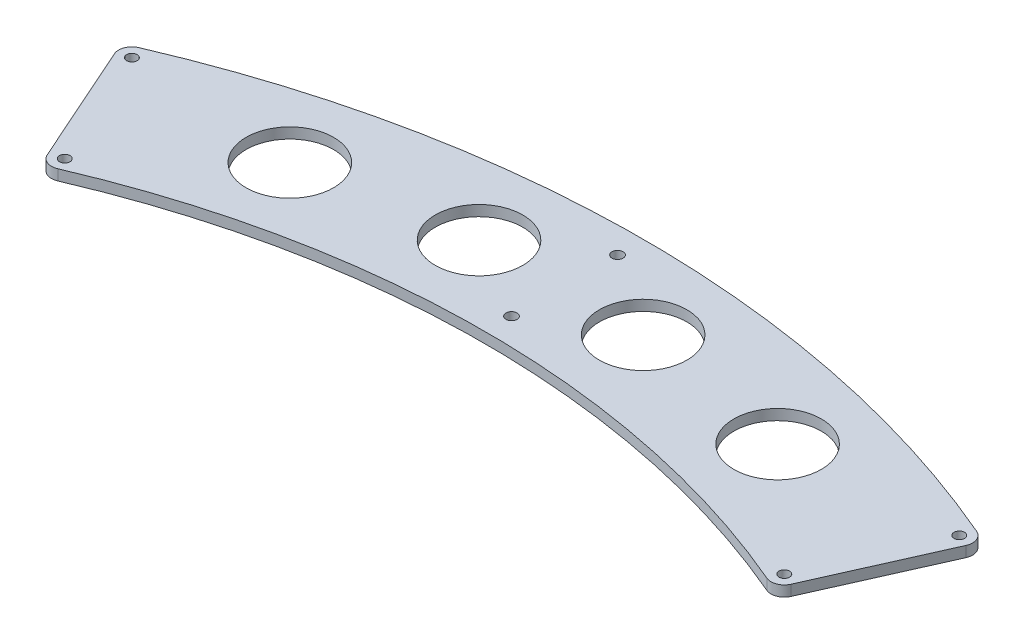
ISO-10303-21;
HEADER;
FILE_DESCRIPTION(('STEP AP214'),'2;1');
FILE_NAME('part.step','',(''),(''),'','','');
FILE_SCHEMA(('AUTOMOTIVE_DESIGN { 1 0 10303 214 1 1 1 1 }'));
ENDSEC;
DATA;
#1=APPLICATION_CONTEXT('core data for automotive mechanical design processes');
#2=APPLICATION_PROTOCOL_DEFINITION('international standard','automotive_design',2000,#1);
#3=PRODUCT_CONTEXT('',#1,'mechanical');
#4=PRODUCT('Part','Part','',(#3));
#5=PRODUCT_RELATED_PRODUCT_CATEGORY('part','',(#4));
#6=PRODUCT_DEFINITION_FORMATION('','',#4);
#7=PRODUCT_DEFINITION_CONTEXT('part definition',#1,'design');
#8=PRODUCT_DEFINITION('design','',#6,#7);
#9=PRODUCT_DEFINITION_SHAPE('','',#8);
#10=(LENGTH_UNIT() NAMED_UNIT(*) SI_UNIT(.MILLI.,.METRE.));
#11=(NAMED_UNIT(*) PLANE_ANGLE_UNIT() SI_UNIT($,.RADIAN.));
#12=(NAMED_UNIT(*) SI_UNIT($,.STERADIAN.) SOLID_ANGLE_UNIT());
#13=UNCERTAINTY_MEASURE_WITH_UNIT(LENGTH_MEASURE(1.E-05),#10,'distance_accuracy_value','');
#14=(GEOMETRIC_REPRESENTATION_CONTEXT(3) GLOBAL_UNCERTAINTY_ASSIGNED_CONTEXT((#13)) GLOBAL_UNIT_ASSIGNED_CONTEXT((#10,
#11,#12)) REPRESENTATION_CONTEXT('',''));
#15=CARTESIAN_POINT('',(0.,0.,0.));
#16=DIRECTION('',(0.,0.,1.));
#17=DIRECTION('',(1.,0.,0.));
#18=AXIS2_PLACEMENT_3D('',#15,#16,#17);
#19=CARTESIAN_POINT('',(0.,-4.,0.));
#20=DIRECTION('',(0.,1.,0.));
#21=DIRECTION('',(0.,0.,1.));
#22=AXIS2_PLACEMENT_3D('',#19,#20,#21);
#23=CYLINDRICAL_SURFACE('',#22,340.);
#24=CARTESIAN_POINT('',(0.,0.,0.));
#25=DIRECTION('',(0.,-1.,0.));
#26=DIRECTION('',(0.,0.,1.));
#27=AXIS2_PLACEMENT_3D('',#24,#25,#26);
#28=CIRCLE('',#27,340.);
#29=CARTESIAN_POINT('',(-133.77440628349,0.,-312.577043660438));
#30=VERTEX_POINT('',#29);
#31=CARTESIAN_POINT('',(133.774406283492,0.,-312.577043660438));
#32=VERTEX_POINT('',#31);
#33=EDGE_CURVE('E159',#30,#32,#28,.T.);
#34=ORIENTED_EDGE('',*,*,#33,.F.);
#35=DIRECTION('',(0.,1.,0.));
#36=VECTOR('',#35,1.);
#37=CARTESIAN_POINT('',(-133.77440628349,-4.,-312.577043660438));
#38=LINE('',#37,#36);
#39=CARTESIAN_POINT('',(-133.77440628349,-4.,-312.577043660438));
#40=VERTEX_POINT('',#39);
#41=EDGE_CURVE('E150',#30,#40,#38,.F.);
#42=ORIENTED_EDGE('',*,*,#41,.T.);
#43=CARTESIAN_POINT('',(0.,-4.,0.));
#44=DIRECTION('',(0.,-1.,0.));
#45=DIRECTION('',(0.,0.,1.));
#46=AXIS2_PLACEMENT_3D('',#43,#44,#45);
#47=CIRCLE('',#46,340.);
#48=CARTESIAN_POINT('',(133.774406283492,-4.,-312.577043660438));
#49=VERTEX_POINT('',#48);
#50=EDGE_CURVE('E156',#40,#49,#47,.T.);
#51=ORIENTED_EDGE('',*,*,#50,.T.);
#52=DIRECTION('',(0.,1.,0.));
#53=VECTOR('',#52,1.);
#54=CARTESIAN_POINT('',(133.774406283492,-4.,-312.577043660438));
#55=LINE('',#54,#53);
#56=EDGE_CURVE('E147',#49,#32,#55,.T.);
#57=ORIENTED_EDGE('',*,*,#56,.T.);
#58=EDGE_LOOP('',(#34,#42,#51,#57));
#59=FACE_BOUND('',#58,.T.);
#60=ADVANCED_FACE('F36',(#59),#23,.F.);
#61=CARTESIAN_POINT('',(-162.694657230318,-4.,-365.418183057041));
#62=DIRECTION('',(-0.913545457642603,0.,0.406736643075795));
#63=DIRECTION('',(0.406736643075795,0.,0.913545457642603));
#64=AXIS2_PLACEMENT_3D('',#61,#62,#63);
#65=PLANE('',#64);
#66=DIRECTION('',(0.406736643075795,0.,0.913545457642603));
#67=VECTOR('',#66,1.);
#68=CARTESIAN_POINT('',(-162.694657230318,0.,-365.418183057041));
#69=LINE('',#68,#67);
#70=CARTESIAN_POINT('',(-160.648102086543,0.,-360.8215449443));
#71=VERTEX_POINT('',#70);
#72=CARTESIAN_POINT('',(-140.309404252343,0.,-315.14008167536));
#73=VERTEX_POINT('',#72);
#74=EDGE_CURVE('E120',#71,#73,#69,.T.);
#75=ORIENTED_EDGE('',*,*,#74,.F.);
#76=DIRECTION('',(0.,1.,0.));
#77=VECTOR('',#76,1.);
#78=CARTESIAN_POINT('',(-160.648102086543,-4.,-360.8215449443));
#79=LINE('',#78,#77);
#80=CARTESIAN_POINT('',(-160.648102086543,-4.,-360.8215449443));
#81=VERTEX_POINT('',#80);
#82=EDGE_CURVE('E138',#71,#81,#79,.F.);
#83=ORIENTED_EDGE('',*,*,#82,.T.);
#84=DIRECTION('',(0.406736643075795,0.,0.913545457642603));
#85=VECTOR('',#84,1.);
#86=CARTESIAN_POINT('',(-162.694657230318,-4.,-365.418183057041));
#87=LINE('',#86,#85);
#88=CARTESIAN_POINT('',(-140.309404252343,-4.,-315.14008167536));
#89=VERTEX_POINT('',#88);
#90=EDGE_CURVE('E123',#81,#89,#87,.T.);
#91=ORIENTED_EDGE('',*,*,#90,.T.);
#92=DIRECTION('',(0.,1.,0.));
#93=VECTOR('',#92,1.);
#94=CARTESIAN_POINT('',(-140.309404252343,-4.,-315.14008167536));
#95=LINE('',#94,#93);
#96=EDGE_CURVE('E135',#89,#73,#95,.T.);
#97=ORIENTED_EDGE('',*,*,#96,.T.);
#98=EDGE_LOOP('',(#75,#83,#91,#97));
#99=FACE_BOUND('',#98,.T.);
#100=ADVANCED_FACE('F172',(#99),#65,.T.);
#101=CARTESIAN_POINT('',(0.,-4.,0.));
#102=DIRECTION('',(0.,1.,0.));
#103=DIRECTION('',(0.,0.,1.));
#104=AXIS2_PLACEMENT_3D('',#101,#102,#103);
#105=CYLINDRICAL_SURFACE('',#104,400.);
#106=CARTESIAN_POINT('',(0.,-4.,0.));
#107=DIRECTION('',(0.,1.,0.));
#108=DIRECTION('',(0.,0.,1.));
#109=AXIS2_PLACEMENT_3D('',#106,#107,#108);
#110=CIRCLE('',#109,400.);
#111=CARTESIAN_POINT('',(158.056075745147,-4.,-367.448332313598));
#112=VERTEX_POINT('',#111);
#113=CARTESIAN_POINT('',(-158.056075745144,-4.,-367.448332313599));
#114=VERTEX_POINT('',#113);
#115=EDGE_CURVE('E127',#112,#114,#110,.T.);
#116=ORIENTED_EDGE('',*,*,#115,.T.);
#117=DIRECTION('',(0.,1.,0.));
#118=VECTOR('',#117,1.);
#119=CARTESIAN_POINT('',(-158.056075745144,-4.,-367.448332313599));
#120=LINE('',#119,#118);
#121=CARTESIAN_POINT('',(-158.056075745144,0.,-367.448332313599));
#122=VERTEX_POINT('',#121);
#123=EDGE_CURVE('E119',#114,#122,#120,.T.);
#124=ORIENTED_EDGE('',*,*,#123,.T.);
#125=CARTESIAN_POINT('',(0.,0.,0.));
#126=DIRECTION('',(0.,1.,0.));
#127=DIRECTION('',(0.,0.,1.));
#128=AXIS2_PLACEMENT_3D('',#125,#126,#127);
#129=CIRCLE('',#128,400.);
#130=CARTESIAN_POINT('',(158.056075745147,0.,-367.448332313598));
#131=VERTEX_POINT('',#130);
#132=EDGE_CURVE('E105',#131,#122,#129,.T.);
#133=ORIENTED_EDGE('',*,*,#132,.F.);
#134=DIRECTION('',(0.,1.,0.));
#135=VECTOR('',#134,1.);
#136=CARTESIAN_POINT('',(158.056075745147,-4.,-367.448332313598));
#137=LINE('',#136,#135);
#138=EDGE_CURVE('E117',#131,#112,#137,.F.);
#139=ORIENTED_EDGE('',*,*,#138,.T.);
#140=EDGE_LOOP('',(#116,#124,#133,#139));
#141=FACE_BOUND('',#140,.T.);
#142=ADVANCED_FACE('F116',(#141),#105,.T.);
#143=CARTESIAN_POINT('',(138.290458645772,-4.,-310.605455598484));
#144=DIRECTION('',(0.913545457642601,0.,0.406736643075801));
#145=DIRECTION('',(0.406736643075801,0.,-0.913545457642601));
#146=AXIS2_PLACEMENT_3D('',#143,#144,#145);
#147=PLANE('',#146);
#148=DIRECTION('',(0.406736643075801,0.,-0.913545457642601));
#149=VECTOR('',#148,1.);
#150=CARTESIAN_POINT('',(138.290458645772,-4.,-310.605455598484));
#151=LINE('',#150,#149);
#152=CARTESIAN_POINT('',(140.309404252345,-4.,-315.140081675359));
#153=VERTEX_POINT('',#152);
#154=CARTESIAN_POINT('',(160.648102086545,-4.,-360.821544944299));
#155=VERTEX_POINT('',#154);
#156=EDGE_CURVE('E165',#153,#155,#151,.T.);
#157=ORIENTED_EDGE('',*,*,#156,.T.);
#158=DIRECTION('',(0.,1.,0.));
#159=VECTOR('',#158,1.);
#160=CARTESIAN_POINT('',(160.648102086545,-4.,-360.821544944299));
#161=LINE('',#160,#159);
#162=CARTESIAN_POINT('',(160.648102086545,0.,-360.821544944299));
#163=VERTEX_POINT('',#162);
#164=EDGE_CURVE('E11',#155,#163,#161,.T.);
#165=ORIENTED_EDGE('',*,*,#164,.T.);
#166=DIRECTION('',(0.406736643075801,0.,-0.913545457642601));
#167=VECTOR('',#166,1.);
#168=CARTESIAN_POINT('',(138.290458645772,0.,-310.605455598484));
#169=LINE('',#168,#167);
#170=CARTESIAN_POINT('',(140.309404252345,0.,-315.140081675359));
#171=VERTEX_POINT('',#170);
#172=EDGE_CURVE('E106',#171,#163,#169,.T.);
#173=ORIENTED_EDGE('',*,*,#172,.F.);
#174=DIRECTION('',(0.,1.,0.));
#175=VECTOR('',#174,1.);
#176=CARTESIAN_POINT('',(140.309404252345,-4.,-315.140081675359));
#177=LINE('',#176,#175);
#178=EDGE_CURVE('E44',#171,#153,#177,.F.);
#179=ORIENTED_EDGE('',*,*,#178,.T.);
#180=EDGE_LOOP('',(#157,#165,#173,#179));
#181=FACE_BOUND('',#180,.T.);
#182=ADVANCED_FACE('F289',(#181),#147,.T.);
#183=CARTESIAN_POINT('',(0.,-4.,0.));
#184=DIRECTION('',(0.,1.,0.));
#185=DIRECTION('',(0.,0.,1.));
#186=AXIS2_PLACEMENT_3D('',#183,#184,#185);
#187=PLANE('',#186);
#188=CARTESIAN_POINT('',(-156.08037479833,-4.,-362.855228159679));
#189=DIRECTION('',(0.,1.,0.));
#190=DIRECTION('',(0.,0.,1.));
#191=AXIS2_PLACEMENT_3D('',#188,#189,#190);
#192=CIRCLE('',#191,2.);
#193=CARTESIAN_POINT('',(-156.08037479833,-4.,-360.855228159679));
#194=VERTEX_POINT('',#193);
#195=EDGE_CURVE('E238',#194,#194,#192,.T.);
#196=ORIENTED_EDGE('',*,*,#195,.T.);
#197=EDGE_LOOP('',(#196));
#198=FACE_BOUND('',#197,.T.);
#199=CARTESIAN_POINT('',(-135.74167696413,-4.,-317.173764890739));
#200=DIRECTION('',(0.,1.,0.));
#201=DIRECTION('',(0.,0.,1.));
#202=AXIS2_PLACEMENT_3D('',#199,#200,#201);
#203=CIRCLE('',#202,2.00000000000002);
#204=CARTESIAN_POINT('',(-135.74167696413,-4.,-315.173764890739));
#205=VERTEX_POINT('',#204);
#206=EDGE_CURVE('E232',#205,#205,#203,.T.);
#207=ORIENTED_EDGE('',*,*,#206,.T.);
#208=EDGE_LOOP('',(#207));
#209=FACE_BOUND('',#208,.T.);
#210=CARTESIAN_POINT('',(135.741676964129,-4.,-317.173764890739));
#211=DIRECTION('',(0.,1.,0.));
#212=DIRECTION('',(0.,0.,1.));
#213=AXIS2_PLACEMENT_3D('',#210,#211,#212);
#214=CIRCLE('',#213,2.00000000000002);
#215=CARTESIAN_POINT('',(135.741676964129,-4.,-315.173764890739));
#216=VERTEX_POINT('',#215);
#217=EDGE_CURVE('E226',#216,#216,#214,.T.);
#218=ORIENTED_EDGE('',*,*,#217,.T.);
#219=EDGE_LOOP('',(#218));
#220=FACE_BOUND('',#219,.T.);
#221=CARTESIAN_POINT('',(156.08037479833,-4.,-362.855228159679));
#222=DIRECTION('',(0.,1.,0.));
#223=DIRECTION('',(0.,0.,1.));
#224=AXIS2_PLACEMENT_3D('',#221,#222,#223);
#225=CIRCLE('',#224,2.00000000000002);
#226=CARTESIAN_POINT('',(156.08037479833,-4.,-360.855228159679));
#227=VERTEX_POINT('',#226);
#228=EDGE_CURVE('E218',#227,#227,#225,.T.);
#229=ORIENTED_EDGE('',*,*,#228,.T.);
#230=EDGE_LOOP('',(#229));
#231=FACE_BOUND('',#230,.T.);
#232=CARTESIAN_POINT('',(0.,-4.,-390.));
#233=DIRECTION('',(0.,1.,0.));
#234=DIRECTION('',(0.,0.,1.));
#235=AXIS2_PLACEMENT_3D('',#232,#233,#234);
#236=CIRCLE('',#235,2.09999999999999);
#237=CARTESIAN_POINT('',(0.,-4.,-387.9));
#238=VERTEX_POINT('',#237);
#239=EDGE_CURVE('E212',#238,#238,#236,.T.);
#240=ORIENTED_EDGE('',*,*,#239,.T.);
#241=EDGE_LOOP('',(#240));
#242=FACE_BOUND('',#241,.T.);
#243=CARTESIAN_POINT('',(0.,-4.,-350.));
#244=DIRECTION('',(0.,1.,0.));
#245=DIRECTION('',(0.,0.,1.));
#246=AXIS2_PLACEMENT_3D('',#243,#244,#245);
#247=CIRCLE('',#246,2.09999999999999);
#248=CARTESIAN_POINT('',(0.,-4.,-347.9));
#249=VERTEX_POINT('',#248);
#250=EDGE_CURVE('E206',#249,#249,#247,.T.);
#251=ORIENTED_EDGE('',*,*,#250,.T.);
#252=EDGE_LOOP('',(#251));
#253=FACE_BOUND('',#252,.T.);
#254=CARTESIAN_POINT('',(-92.0152582509941,-4.,-358.375769617594));
#255=DIRECTION('',(0.,1.,0.));
#256=DIRECTION('',(0.,0.,1.));
#257=AXIS2_PLACEMENT_3D('',#254,#255,#256);
#258=CIRCLE('',#257,16.5000000000002);
#259=CARTESIAN_POINT('',(-92.0152582509941,-4.,-341.875769617594));
#260=VERTEX_POINT('',#259);
#261=EDGE_CURVE('E200',#260,#260,#258,.T.);
#262=ORIENTED_EDGE('',*,*,#261,.T.);
#263=EDGE_LOOP('',(#262));
#264=FACE_BOUND('',#263,.T.);
#265=CARTESIAN_POINT('',(92.0152582509939,-4.,-358.375769617594));
#266=DIRECTION('',(0.,1.,0.));
#267=DIRECTION('',(0.,0.,1.));
#268=AXIS2_PLACEMENT_3D('',#265,#266,#267);
#269=CIRCLE('',#268,16.5000000000012);
#270=CARTESIAN_POINT('',(92.0152582509939,-4.,-341.875769617593));
#271=VERTEX_POINT('',#270);
#272=EDGE_CURVE('E194',#271,#271,#269,.T.);
#273=ORIENTED_EDGE('',*,*,#272,.T.);
#274=EDGE_LOOP('',(#273));
#275=FACE_BOUND('',#274,.T.);
#276=CARTESIAN_POINT('',(-30.9608020329543,-4.,-368.702357922317));
#277=DIRECTION('',(0.,1.,0.));
#278=DIRECTION('',(0.,0.,1.));
#279=AXIS2_PLACEMENT_3D('',#276,#277,#278);
#280=CIRCLE('',#279,16.5);
#281=CARTESIAN_POINT('',(-30.9608020329543,-4.,-352.202357922317));
#282=VERTEX_POINT('',#281);
#283=EDGE_CURVE('E188',#282,#282,#280,.T.);
#284=ORIENTED_EDGE('',*,*,#283,.T.);
#285=EDGE_LOOP('',(#284));
#286=FACE_BOUND('',#285,.T.);
#287=CARTESIAN_POINT('',(30.9608020329542,-4.,-368.702357922317));
#288=DIRECTION('',(0.,1.,0.));
#289=DIRECTION('',(0.,0.,1.));
#290=AXIS2_PLACEMENT_3D('',#287,#288,#289);
#291=CIRCLE('',#290,16.5);
#292=CARTESIAN_POINT('',(30.9608020329542,-4.,-352.202357922317));
#293=VERTEX_POINT('',#292);
#294=EDGE_CURVE('E181',#293,#293,#291,.T.);
#295=ORIENTED_EDGE('',*,*,#294,.T.);
#296=EDGE_LOOP('',(#295));
#297=FACE_BOUND('',#296,.T.);
#298=ORIENTED_EDGE('',*,*,#90,.F.);
#299=CARTESIAN_POINT('',(-156.08037479833,-4.,-362.855228159679));
#300=DIRECTION('',(0.,1.,0.));
#301=DIRECTION('',(0.,0.,1.));
#302=AXIS2_PLACEMENT_3D('',#299,#300,#301);
#303=CIRCLE('',#302,5.);
#304=EDGE_CURVE('E145',#81,#114,#303,.F.);
#305=ORIENTED_EDGE('',*,*,#304,.T.);
#306=ORIENTED_EDGE('',*,*,#115,.F.);
#307=CARTESIAN_POINT('',(156.080374798332,-4.,-362.855228159678));
#308=DIRECTION('',(0.,1.,0.));
#309=DIRECTION('',(0.,0.,1.));
#310=AXIS2_PLACEMENT_3D('',#307,#308,#309);
#311=CIRCLE('',#310,5.);
#312=EDGE_CURVE('E51',#112,#155,#311,.F.);
#313=ORIENTED_EDGE('',*,*,#312,.T.);
#314=ORIENTED_EDGE('',*,*,#156,.F.);
#315=CARTESIAN_POINT('',(135.741676964132,-4.,-317.173764890738));
#316=DIRECTION('',(0.,1.,0.));
#317=DIRECTION('',(0.,0.,1.));
#318=AXIS2_PLACEMENT_3D('',#315,#316,#317);
#319=CIRCLE('',#318,5.);
#320=EDGE_CURVE('E140',#153,#49,#319,.F.);
#321=ORIENTED_EDGE('',*,*,#320,.T.);
#322=ORIENTED_EDGE('',*,*,#50,.F.);
#323=CARTESIAN_POINT('',(-135.74167696413,-4.,-317.173764890739));
#324=DIRECTION('',(0.,1.,0.));
#325=DIRECTION('',(0.,0.,1.));
#326=AXIS2_PLACEMENT_3D('',#323,#324,#325);
#327=CIRCLE('',#326,5.);
#328=EDGE_CURVE('E143',#40,#89,#327,.F.);
#329=ORIENTED_EDGE('',*,*,#328,.T.);
#330=EDGE_LOOP('',(#298,#305,#306,#313,#314,#321,#322,#329));
#331=FACE_BOUND('',#330,.T.);
#332=ADVANCED_FACE('F163',(#198,#209,#220,#231,#242,#253,#264,#275,#286,#297,#331),#187,.F.);
#333=CARTESIAN_POINT('',(0.,0.,0.));
#334=DIRECTION('',(0.,1.,0.));
#335=DIRECTION('',(0.,0.,1.));
#336=AXIS2_PLACEMENT_3D('',#333,#334,#335);
#337=PLANE('',#336);
#338=CARTESIAN_POINT('',(-156.08037479833,0.,-362.855228159679));
#339=DIRECTION('',(0.,1.,0.));
#340=DIRECTION('',(0.,0.,1.));
#341=AXIS2_PLACEMENT_3D('',#338,#339,#340);
#342=CIRCLE('',#341,2.);
#343=CARTESIAN_POINT('',(-156.08037479833,0.,-360.855228159679));
#344=VERTEX_POINT('',#343);
#345=EDGE_CURVE('E241',#344,#344,#342,.T.);
#346=ORIENTED_EDGE('',*,*,#345,.F.);
#347=EDGE_LOOP('',(#346));
#348=FACE_BOUND('',#347,.T.);
#349=CARTESIAN_POINT('',(-135.74167696413,0.,-317.173764890739));
#350=DIRECTION('',(0.,1.,0.));
#351=DIRECTION('',(0.,0.,1.));
#352=AXIS2_PLACEMENT_3D('',#349,#350,#351);
#353=CIRCLE('',#352,2.00000000000002);
#354=CARTESIAN_POINT('',(-135.74167696413,0.,-315.173764890739));
#355=VERTEX_POINT('',#354);
#356=EDGE_CURVE('E235',#355,#355,#353,.T.);
#357=ORIENTED_EDGE('',*,*,#356,.F.);
#358=EDGE_LOOP('',(#357));
#359=FACE_BOUND('',#358,.T.);
#360=CARTESIAN_POINT('',(135.741676964129,0.,-317.173764890739));
#361=DIRECTION('',(0.,1.,0.));
#362=DIRECTION('',(0.,0.,1.));
#363=AXIS2_PLACEMENT_3D('',#360,#361,#362);
#364=CIRCLE('',#363,2.00000000000002);
#365=CARTESIAN_POINT('',(135.741676964129,0.,-315.173764890739));
#366=VERTEX_POINT('',#365);
#367=EDGE_CURVE('E229',#366,#366,#364,.T.);
#368=ORIENTED_EDGE('',*,*,#367,.F.);
#369=EDGE_LOOP('',(#368));
#370=FACE_BOUND('',#369,.T.);
#371=CARTESIAN_POINT('',(156.08037479833,0.,-362.855228159679));
#372=DIRECTION('',(0.,1.,0.));
#373=DIRECTION('',(0.,0.,1.));
#374=AXIS2_PLACEMENT_3D('',#371,#372,#373);
#375=CIRCLE('',#374,2.00000000000002);
#376=CARTESIAN_POINT('',(156.08037479833,0.,-360.855228159679));
#377=VERTEX_POINT('',#376);
#378=EDGE_CURVE('E223',#377,#377,#375,.T.);
#379=ORIENTED_EDGE('',*,*,#378,.F.);
#380=EDGE_LOOP('',(#379));
#381=FACE_BOUND('',#380,.T.);
#382=CARTESIAN_POINT('',(0.,0.,-390.));
#383=DIRECTION('',(0.,1.,0.));
#384=DIRECTION('',(0.,0.,1.));
#385=AXIS2_PLACEMENT_3D('',#382,#383,#384);
#386=CIRCLE('',#385,2.09999999999999);
#387=CARTESIAN_POINT('',(0.,0.,-387.9));
#388=VERTEX_POINT('',#387);
#389=EDGE_CURVE('E215',#388,#388,#386,.T.);
#390=ORIENTED_EDGE('',*,*,#389,.F.);
#391=EDGE_LOOP('',(#390));
#392=FACE_BOUND('',#391,.T.);
#393=CARTESIAN_POINT('',(0.,0.,-350.));
#394=DIRECTION('',(0.,1.,0.));
#395=DIRECTION('',(0.,0.,1.));
#396=AXIS2_PLACEMENT_3D('',#393,#394,#395);
#397=CIRCLE('',#396,2.09999999999999);
#398=CARTESIAN_POINT('',(0.,0.,-347.9));
#399=VERTEX_POINT('',#398);
#400=EDGE_CURVE('E209',#399,#399,#397,.T.);
#401=ORIENTED_EDGE('',*,*,#400,.F.);
#402=EDGE_LOOP('',(#401));
#403=FACE_BOUND('',#402,.T.);
#404=CARTESIAN_POINT('',(-92.0152582509941,0.,-358.375769617594));
#405=DIRECTION('',(0.,1.,0.));
#406=DIRECTION('',(0.,0.,1.));
#407=AXIS2_PLACEMENT_3D('',#404,#405,#406);
#408=CIRCLE('',#407,16.5000000000002);
#409=CARTESIAN_POINT('',(-92.0152582509941,0.,-341.875769617594));
#410=VERTEX_POINT('',#409);
#411=EDGE_CURVE('E203',#410,#410,#408,.T.);
#412=ORIENTED_EDGE('',*,*,#411,.F.);
#413=EDGE_LOOP('',(#412));
#414=FACE_BOUND('',#413,.T.);
#415=CARTESIAN_POINT('',(92.0152582509939,0.,-358.375769617594));
#416=DIRECTION('',(0.,1.,0.));
#417=DIRECTION('',(0.,0.,1.));
#418=AXIS2_PLACEMENT_3D('',#415,#416,#417);
#419=CIRCLE('',#418,16.5000000000012);
#420=CARTESIAN_POINT('',(92.0152582509939,0.,-341.875769617593));
#421=VERTEX_POINT('',#420);
#422=EDGE_CURVE('E197',#421,#421,#419,.T.);
#423=ORIENTED_EDGE('',*,*,#422,.F.);
#424=EDGE_LOOP('',(#423));
#425=FACE_BOUND('',#424,.T.);
#426=CARTESIAN_POINT('',(-30.9608020329543,0.,-368.702357922317));
#427=DIRECTION('',(0.,1.,0.));
#428=DIRECTION('',(0.,0.,1.));
#429=AXIS2_PLACEMENT_3D('',#426,#427,#428);
#430=CIRCLE('',#429,16.5);
#431=CARTESIAN_POINT('',(-30.9608020329543,0.,-352.202357922317));
#432=VERTEX_POINT('',#431);
#433=EDGE_CURVE('E191',#432,#432,#430,.T.);
#434=ORIENTED_EDGE('',*,*,#433,.F.);
#435=EDGE_LOOP('',(#434));
#436=FACE_BOUND('',#435,.T.);
#437=CARTESIAN_POINT('',(30.9608020329542,0.,-368.702357922317));
#438=DIRECTION('',(0.,1.,0.));
#439=DIRECTION('',(0.,0.,1.));
#440=AXIS2_PLACEMENT_3D('',#437,#438,#439);
#441=CIRCLE('',#440,16.5);
#442=CARTESIAN_POINT('',(30.9608020329542,0.,-352.202357922317));
#443=VERTEX_POINT('',#442);
#444=EDGE_CURVE('E183',#443,#443,#441,.T.);
#445=ORIENTED_EDGE('',*,*,#444,.F.);
#446=EDGE_LOOP('',(#445));
#447=FACE_BOUND('',#446,.T.);
#448=ORIENTED_EDGE('',*,*,#132,.T.);
#449=CARTESIAN_POINT('',(-156.08037479833,0.,-362.855228159679));
#450=DIRECTION('',(0.,1.,0.));
#451=DIRECTION('',(0.,0.,1.));
#452=AXIS2_PLACEMENT_3D('',#449,#450,#451);
#453=CIRCLE('',#452,5.);
#454=EDGE_CURVE('E133',#122,#71,#453,.T.);
#455=ORIENTED_EDGE('',*,*,#454,.T.);
#456=ORIENTED_EDGE('',*,*,#74,.T.);
#457=CARTESIAN_POINT('',(-135.74167696413,0.,-317.173764890739));
#458=DIRECTION('',(0.,1.,0.));
#459=DIRECTION('',(0.,0.,1.));
#460=AXIS2_PLACEMENT_3D('',#457,#458,#459);
#461=CIRCLE('',#460,5.);
#462=EDGE_CURVE('E110',#73,#30,#461,.T.);
#463=ORIENTED_EDGE('',*,*,#462,.T.);
#464=ORIENTED_EDGE('',*,*,#33,.T.);
#465=CARTESIAN_POINT('',(135.741676964132,0.,-317.173764890738));
#466=DIRECTION('',(0.,1.,0.));
#467=DIRECTION('',(0.,0.,1.));
#468=AXIS2_PLACEMENT_3D('',#465,#466,#467);
#469=CIRCLE('',#468,5.);
#470=EDGE_CURVE('E111',#32,#171,#469,.T.);
#471=ORIENTED_EDGE('',*,*,#470,.T.);
#472=ORIENTED_EDGE('',*,*,#172,.T.);
#473=CARTESIAN_POINT('',(156.080374798332,0.,-362.855228159678));
#474=DIRECTION('',(0.,1.,0.));
#475=DIRECTION('',(0.,0.,1.));
#476=AXIS2_PLACEMENT_3D('',#473,#474,#475);
#477=CIRCLE('',#476,5.);
#478=EDGE_CURVE('E102',#163,#131,#477,.T.);
#479=ORIENTED_EDGE('',*,*,#478,.T.);
#480=EDGE_LOOP('',(#448,#455,#456,#463,#464,#471,#472,#479));
#481=FACE_BOUND('',#480,.T.);
#482=ADVANCED_FACE('F104',(#348,#359,#370,#381,#392,#403,#414,#425,#436,#447,#481),#337,.T.);
#483=CARTESIAN_POINT('',(30.9608020329542,-4.,-368.702357922317));
#484=DIRECTION('',(0.,1.,0.));
#485=DIRECTION('',(0.,0.,1.));
#486=AXIS2_PLACEMENT_3D('',#483,#484,#485);
#487=CYLINDRICAL_SURFACE('',#486,16.5);
#488=ORIENTED_EDGE('',*,*,#294,.F.);
#489=EDGE_LOOP('',(#488));
#490=FACE_BOUND('',#489,.T.);
#491=ORIENTED_EDGE('',*,*,#444,.T.);
#492=EDGE_LOOP('',(#491));
#493=FACE_BOUND('',#492,.T.);
#494=ADVANCED_FACE('F250',(#490,#493),#487,.F.);
#495=CARTESIAN_POINT('',(-30.9608020329543,-4.,-368.702357922317));
#496=DIRECTION('',(0.,1.,0.));
#497=DIRECTION('',(0.,0.,1.));
#498=AXIS2_PLACEMENT_3D('',#495,#496,#497);
#499=CYLINDRICAL_SURFACE('',#498,16.5);
#500=ORIENTED_EDGE('',*,*,#283,.F.);
#501=EDGE_LOOP('',(#500));
#502=FACE_BOUND('',#501,.T.);
#503=ORIENTED_EDGE('',*,*,#433,.T.);
#504=EDGE_LOOP('',(#503));
#505=FACE_BOUND('',#504,.T.);
#506=ADVANCED_FACE('F271',(#502,#505),#499,.F.);
#507=CARTESIAN_POINT('',(92.0152582509939,-4.,-358.375769617594));
#508=DIRECTION('',(0.,1.,0.));
#509=DIRECTION('',(0.,0.,1.));
#510=AXIS2_PLACEMENT_3D('',#507,#508,#509);
#511=CYLINDRICAL_SURFACE('',#510,16.5000000000012);
#512=ORIENTED_EDGE('',*,*,#272,.F.);
#513=EDGE_LOOP('',(#512));
#514=FACE_BOUND('',#513,.T.);
#515=ORIENTED_EDGE('',*,*,#422,.T.);
#516=EDGE_LOOP('',(#515));
#517=FACE_BOUND('',#516,.T.);
#518=ADVANCED_FACE('F277',(#514,#517),#511,.F.);
#519=CARTESIAN_POINT('',(-92.0152582509941,-4.,-358.375769617594));
#520=DIRECTION('',(0.,1.,0.));
#521=DIRECTION('',(0.,0.,1.));
#522=AXIS2_PLACEMENT_3D('',#519,#520,#521);
#523=CYLINDRICAL_SURFACE('',#522,16.5000000000002);
#524=ORIENTED_EDGE('',*,*,#261,.F.);
#525=EDGE_LOOP('',(#524));
#526=FACE_BOUND('',#525,.T.);
#527=ORIENTED_EDGE('',*,*,#411,.T.);
#528=EDGE_LOOP('',(#527));
#529=FACE_BOUND('',#528,.T.);
#530=ADVANCED_FACE('F346',(#526,#529),#523,.F.);
#531=CARTESIAN_POINT('',(0.,-4.,-350.));
#532=DIRECTION('',(0.,1.,0.));
#533=DIRECTION('',(0.,0.,1.));
#534=AXIS2_PLACEMENT_3D('',#531,#532,#533);
#535=CYLINDRICAL_SURFACE('',#534,2.09999999999999);
#536=ORIENTED_EDGE('',*,*,#250,.F.);
#537=EDGE_LOOP('',(#536));
#538=FACE_BOUND('',#537,.T.);
#539=ORIENTED_EDGE('',*,*,#400,.T.);
#540=EDGE_LOOP('',(#539));
#541=FACE_BOUND('',#540,.T.);
#542=ADVANCED_FACE('F334',(#538,#541),#535,.F.);
#543=CARTESIAN_POINT('',(0.,-4.,-390.));
#544=DIRECTION('',(0.,1.,0.));
#545=DIRECTION('',(0.,0.,1.));
#546=AXIS2_PLACEMENT_3D('',#543,#544,#545);
#547=CYLINDRICAL_SURFACE('',#546,2.09999999999999);
#548=ORIENTED_EDGE('',*,*,#239,.F.);
#549=EDGE_LOOP('',(#548));
#550=FACE_BOUND('',#549,.T.);
#551=ORIENTED_EDGE('',*,*,#389,.T.);
#552=EDGE_LOOP('',(#551));
#553=FACE_BOUND('',#552,.T.);
#554=ADVANCED_FACE('F293',(#550,#553),#547,.F.);
#555=CARTESIAN_POINT('',(-156.08037479833,-4.,-362.855228159679));
#556=DIRECTION('',(0.,1.,0.));
#557=DIRECTION('',(0.,0.,1.));
#558=AXIS2_PLACEMENT_3D('',#555,#556,#557);
#559=CYLINDRICAL_SURFACE('',#558,5.);
#560=ORIENTED_EDGE('',*,*,#304,.F.);
#561=ORIENTED_EDGE('',*,*,#82,.F.);
#562=ORIENTED_EDGE('',*,*,#454,.F.);
#563=ORIENTED_EDGE('',*,*,#123,.F.);
#564=EDGE_LOOP('',(#560,#561,#562,#563));
#565=FACE_BOUND('',#564,.T.);
#566=ADVANCED_FACE('F176',(#565),#559,.T.);
#567=CARTESIAN_POINT('',(-135.74167696413,-4.,-317.173764890739));
#568=DIRECTION('',(0.,1.,0.));
#569=DIRECTION('',(0.,0.,1.));
#570=AXIS2_PLACEMENT_3D('',#567,#568,#569);
#571=CYLINDRICAL_SURFACE('',#570,5.);
#572=ORIENTED_EDGE('',*,*,#328,.F.);
#573=ORIENTED_EDGE('',*,*,#41,.F.);
#574=ORIENTED_EDGE('',*,*,#462,.F.);
#575=ORIENTED_EDGE('',*,*,#96,.F.);
#576=EDGE_LOOP('',(#572,#573,#574,#575));
#577=FACE_BOUND('',#576,.T.);
#578=ADVANCED_FACE('F168',(#577),#571,.T.);
#579=CARTESIAN_POINT('',(156.080374798332,-4.,-362.855228159678));
#580=DIRECTION('',(0.,1.,0.));
#581=DIRECTION('',(0.,0.,1.));
#582=AXIS2_PLACEMENT_3D('',#579,#580,#581);
#583=CYLINDRICAL_SURFACE('',#582,5.);
#584=ORIENTED_EDGE('',*,*,#312,.F.);
#585=ORIENTED_EDGE('',*,*,#138,.F.);
#586=ORIENTED_EDGE('',*,*,#478,.F.);
#587=ORIENTED_EDGE('',*,*,#164,.F.);
#588=EDGE_LOOP('',(#584,#585,#586,#587));
#589=FACE_BOUND('',#588,.T.);
#590=ADVANCED_FACE('F122',(#589),#583,.T.);
#591=CARTESIAN_POINT('',(135.741676964132,-4.,-317.173764890738));
#592=DIRECTION('',(0.,1.,0.));
#593=DIRECTION('',(0.,0.,1.));
#594=AXIS2_PLACEMENT_3D('',#591,#592,#593);
#595=CYLINDRICAL_SURFACE('',#594,5.);
#596=ORIENTED_EDGE('',*,*,#320,.F.);
#597=ORIENTED_EDGE('',*,*,#178,.F.);
#598=ORIENTED_EDGE('',*,*,#470,.F.);
#599=ORIENTED_EDGE('',*,*,#56,.F.);
#600=EDGE_LOOP('',(#596,#597,#598,#599));
#601=FACE_BOUND('',#600,.T.);
#602=ADVANCED_FACE('F38',(#601),#595,.T.);
#603=CARTESIAN_POINT('',(156.08037479833,-10.,-362.855228159679));
#604=DIRECTION('',(0.,1.,0.));
#605=DIRECTION('',(0.,0.,1.));
#606=AXIS2_PLACEMENT_3D('',#603,#604,#605);
#607=CYLINDRICAL_SURFACE('',#606,2.00000000000002);
#608=ORIENTED_EDGE('',*,*,#378,.T.);
#609=EDGE_LOOP('',(#608));
#610=FACE_BOUND('',#609,.T.);
#611=ORIENTED_EDGE('',*,*,#228,.F.);
#612=EDGE_LOOP('',(#611));
#613=FACE_BOUND('',#612,.T.);
#614=ADVANCED_FACE('F299',(#610,#613),#607,.F.);
#615=CARTESIAN_POINT('',(135.741676964129,-10.,-317.173764890739));
#616=DIRECTION('',(0.,1.,0.));
#617=DIRECTION('',(0.,0.,1.));
#618=AXIS2_PLACEMENT_3D('',#615,#616,#617);
#619=CYLINDRICAL_SURFACE('',#618,2.00000000000002);
#620=ORIENTED_EDGE('',*,*,#367,.T.);
#621=EDGE_LOOP('',(#620));
#622=FACE_BOUND('',#621,.T.);
#623=ORIENTED_EDGE('',*,*,#217,.F.);
#624=EDGE_LOOP('',(#623));
#625=FACE_BOUND('',#624,.T.);
#626=ADVANCED_FACE('F304',(#622,#625),#619,.F.);
#627=CARTESIAN_POINT('',(-135.74167696413,-10.,-317.173764890739));
#628=DIRECTION('',(0.,1.,0.));
#629=DIRECTION('',(0.,0.,1.));
#630=AXIS2_PLACEMENT_3D('',#627,#628,#629);
#631=CYLINDRICAL_SURFACE('',#630,2.00000000000002);
#632=ORIENTED_EDGE('',*,*,#356,.T.);
#633=EDGE_LOOP('',(#632));
#634=FACE_BOUND('',#633,.T.);
#635=ORIENTED_EDGE('',*,*,#206,.F.);
#636=EDGE_LOOP('',(#635));
#637=FACE_BOUND('',#636,.T.);
#638=ADVANCED_FACE('F441',(#634,#637),#631,.F.);
#639=CARTESIAN_POINT('',(-156.08037479833,-10.,-362.855228159679));
#640=DIRECTION('',(0.,1.,0.));
#641=DIRECTION('',(0.,0.,1.));
#642=AXIS2_PLACEMENT_3D('',#639,#640,#641);
#643=CYLINDRICAL_SURFACE('',#642,2.);
#644=ORIENTED_EDGE('',*,*,#345,.T.);
#645=EDGE_LOOP('',(#644));
#646=FACE_BOUND('',#645,.T.);
#647=ORIENTED_EDGE('',*,*,#195,.F.);
#648=EDGE_LOOP('',(#647));
#649=FACE_BOUND('',#648,.T.);
#650=ADVANCED_FACE('F245',(#646,#649),#643,.F.);
#651=CLOSED_SHELL('',(#60,#100,#142,#182,#332,#482,#494,#506,#518,#530,#542,#554,#566,#578,#590,
#602,#614,#626,#638,#650));
#652=MANIFOLD_SOLID_BREP('B2',#651);
#653=ADVANCED_BREP_SHAPE_REPRESENTATION('',(#18,#652),#14);
#654=SHAPE_DEFINITION_REPRESENTATION(#9,#653);
ENDSEC;
END-ISO-10303-21;
